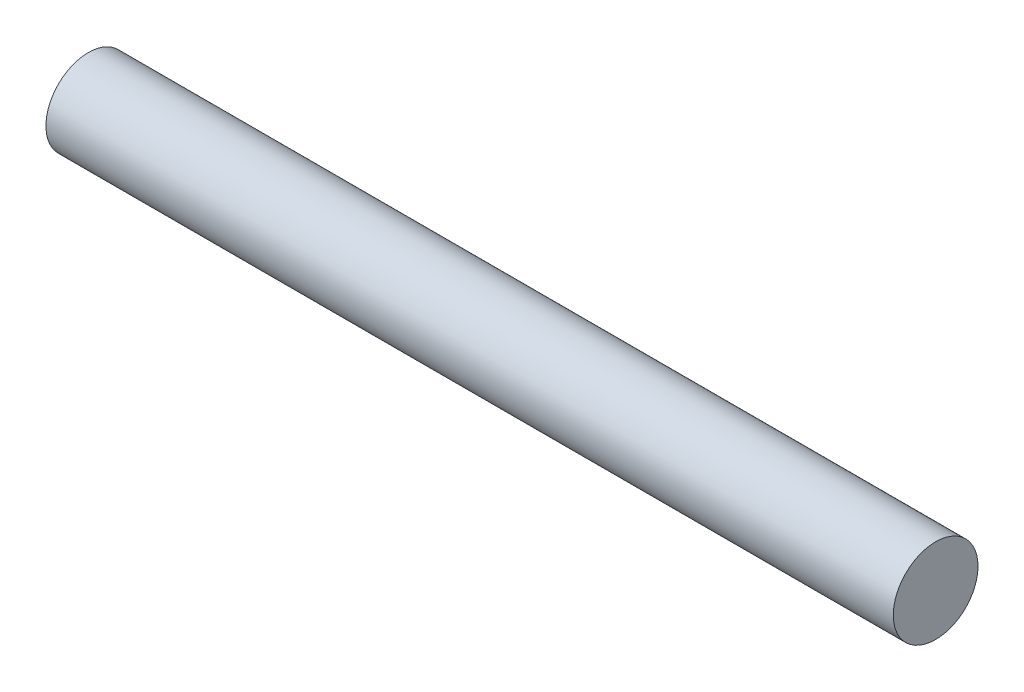
ISO-10303-21;
HEADER;
FILE_DESCRIPTION(('STEP AP214'),'2;1');
FILE_NAME('part.step','',(''),(''),'','','');
FILE_SCHEMA(('AUTOMOTIVE_DESIGN { 1 0 10303 214 1 1 1 1 }'));
ENDSEC;
DATA;
#1=APPLICATION_CONTEXT('core data for automotive mechanical design processes');
#2=APPLICATION_PROTOCOL_DEFINITION('international standard','automotive_design',2000,#1);
#3=PRODUCT_CONTEXT('',#1,'mechanical');
#4=PRODUCT('Part','Part','',(#3));
#5=PRODUCT_RELATED_PRODUCT_CATEGORY('part','',(#4));
#6=PRODUCT_DEFINITION_FORMATION('','',#4);
#7=PRODUCT_DEFINITION_CONTEXT('part definition',#1,'design');
#8=PRODUCT_DEFINITION('design','',#6,#7);
#9=PRODUCT_DEFINITION_SHAPE('','',#8);
#10=(LENGTH_UNIT() NAMED_UNIT(*) SI_UNIT(.MILLI.,.METRE.));
#11=(NAMED_UNIT(*) PLANE_ANGLE_UNIT() SI_UNIT($,.RADIAN.));
#12=(NAMED_UNIT(*) SI_UNIT($,.STERADIAN.) SOLID_ANGLE_UNIT());
#13=UNCERTAINTY_MEASURE_WITH_UNIT(LENGTH_MEASURE(1.E-05),#10,'distance_accuracy_value','');
#14=(GEOMETRIC_REPRESENTATION_CONTEXT(3) GLOBAL_UNCERTAINTY_ASSIGNED_CONTEXT((#13)) GLOBAL_UNIT_ASSIGNED_CONTEXT((#10,
#11,#12)) REPRESENTATION_CONTEXT('',''));
#15=CARTESIAN_POINT('',(0.,0.,0.));
#16=DIRECTION('',(0.,0.,1.));
#17=DIRECTION('',(1.,0.,0.));
#18=AXIS2_PLACEMENT_3D('',#15,#16,#17);
#19=CARTESIAN_POINT('',(500.,0.,0.));
#20=DIRECTION('',(-1.,0.,0.));
#21=DIRECTION('',(0.,0.,1.));
#22=AXIS2_PLACEMENT_3D('',#19,#20,#21);
#23=CYLINDRICAL_SURFACE('',#22,25.);
#24=CARTESIAN_POINT('',(500.,0.,0.));
#25=DIRECTION('',(1.,0.,0.));
#26=DIRECTION('',(0.,0.,-1.));
#27=AXIS2_PLACEMENT_3D('',#24,#25,#26);
#28=CIRCLE('',#27,25.);
#29=CARTESIAN_POINT('',(500.,0.,-25.));
#30=VERTEX_POINT('',#29);
#31=EDGE_CURVE('E10',#30,#30,#28,.T.);
#32=ORIENTED_EDGE('',*,*,#31,.F.);
#33=EDGE_LOOP('',(#32));
#34=FACE_BOUND('',#33,.T.);
#35=CARTESIAN_POINT('',(0.,0.,0.));
#36=DIRECTION('',(1.,0.,0.));
#37=DIRECTION('',(0.,0.,-1.));
#38=AXIS2_PLACEMENT_3D('',#35,#36,#37);
#39=CIRCLE('',#38,25.);
#40=CARTESIAN_POINT('',(0.,0.,-25.));
#41=VERTEX_POINT('',#40);
#42=EDGE_CURVE('E42',#41,#41,#39,.T.);
#43=ORIENTED_EDGE('',*,*,#42,.T.);
#44=EDGE_LOOP('',(#43));
#45=FACE_BOUND('',#44,.T.);
#46=ADVANCED_FACE('F39',(#34,#45),#23,.T.);
#47=CARTESIAN_POINT('',(500.,0.,0.));
#48=DIRECTION('',(1.,0.,0.));
#49=DIRECTION('',(0.,0.,-1.));
#50=AXIS2_PLACEMENT_3D('',#47,#48,#49);
#51=PLANE('',#50);
#52=ORIENTED_EDGE('',*,*,#31,.T.);
#53=EDGE_LOOP('',(#52));
#54=FACE_BOUND('',#53,.T.);
#55=ADVANCED_FACE('F54',(#54),#51,.T.);
#56=CARTESIAN_POINT('',(0.,0.,0.));
#57=DIRECTION('',(1.,0.,0.));
#58=DIRECTION('',(0.,0.,-1.));
#59=AXIS2_PLACEMENT_3D('',#56,#57,#58);
#60=PLANE('',#59);
#61=ORIENTED_EDGE('',*,*,#42,.F.);
#62=EDGE_LOOP('',(#61));
#63=FACE_BOUND('',#62,.T.);
#64=ADVANCED_FACE('F52',(#63),#60,.F.);
#65=CLOSED_SHELL('',(#46,#55,#64));
#66=MANIFOLD_SOLID_BREP('B2',#65);
#67=ADVANCED_BREP_SHAPE_REPRESENTATION('',(#18,#66),#14);
#68=SHAPE_DEFINITION_REPRESENTATION(#9,#67);
ENDSEC;
END-ISO-10303-21;
